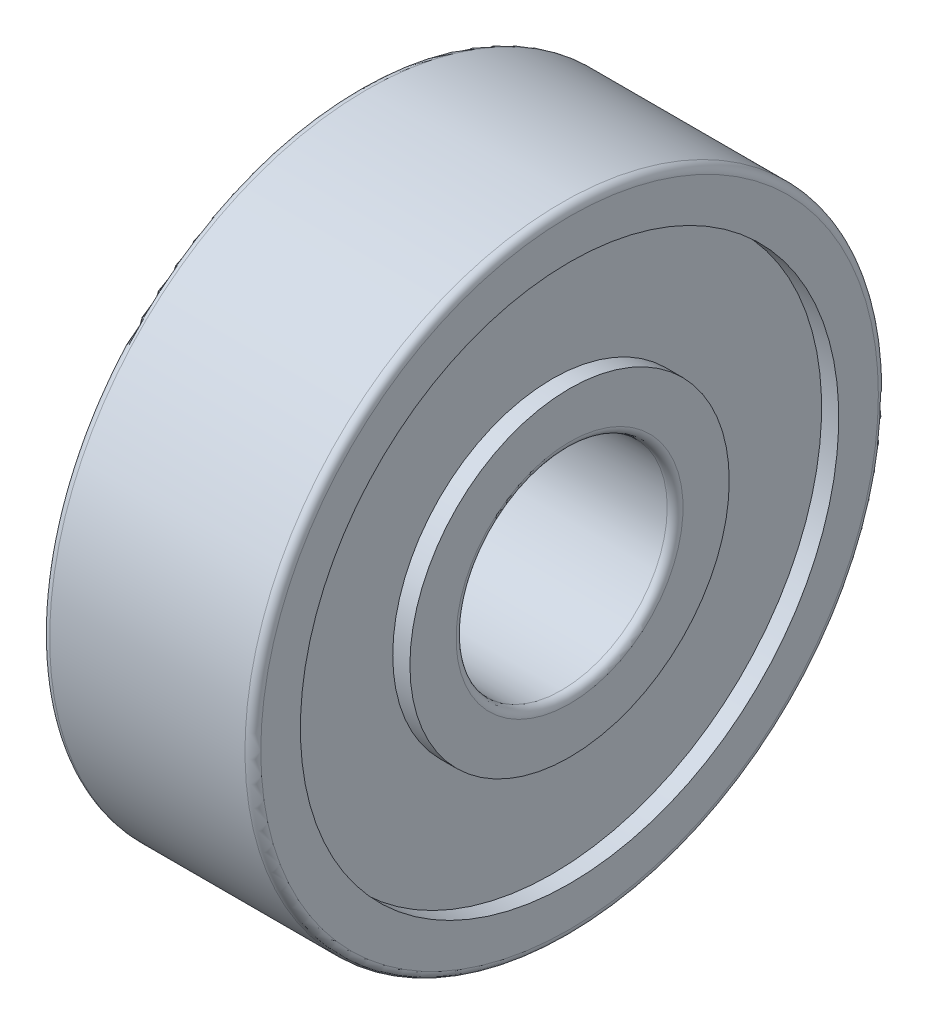
ISO-10303-21;
HEADER;
FILE_DESCRIPTION(('STEP AP214'),'2;1');
FILE_NAME('part.step','',(''),(''),'','','');
FILE_SCHEMA(('AUTOMOTIVE_DESIGN { 1 0 10303 214 1 1 1 1 }'));
ENDSEC;
DATA;
#1=APPLICATION_CONTEXT('core data for automotive mechanical design processes');
#2=APPLICATION_PROTOCOL_DEFINITION('international standard','automotive_design',2000,#1);
#3=PRODUCT_CONTEXT('',#1,'mechanical');
#4=PRODUCT('Part','Part','',(#3));
#5=PRODUCT_RELATED_PRODUCT_CATEGORY('part','',(#4));
#6=PRODUCT_DEFINITION_FORMATION('','',#4);
#7=PRODUCT_DEFINITION_CONTEXT('part definition',#1,'design');
#8=PRODUCT_DEFINITION('design','',#6,#7);
#9=PRODUCT_DEFINITION_SHAPE('','',#8);
#10=(LENGTH_UNIT() NAMED_UNIT(*) SI_UNIT(.MILLI.,.METRE.));
#11=(NAMED_UNIT(*) PLANE_ANGLE_UNIT() SI_UNIT($,.RADIAN.));
#12=(NAMED_UNIT(*) SI_UNIT($,.STERADIAN.) SOLID_ANGLE_UNIT());
#13=UNCERTAINTY_MEASURE_WITH_UNIT(LENGTH_MEASURE(1.E-05),#10,'distance_accuracy_value','');
#14=(GEOMETRIC_REPRESENTATION_CONTEXT(3) GLOBAL_UNCERTAINTY_ASSIGNED_CONTEXT((#13)) GLOBAL_UNIT_ASSIGNED_CONTEXT((#10,
#11,#12)) REPRESENTATION_CONTEXT('',''));
#15=CARTESIAN_POINT('',(0.,0.,0.));
#16=DIRECTION('',(0.,0.,1.));
#17=DIRECTION('',(1.,0.,0.));
#18=AXIS2_PLACEMENT_3D('',#15,#16,#17);
#19=CARTESIAN_POINT('',(0.,0.,0.));
#20=DIRECTION('',(-1.,0.,0.));
#21=DIRECTION('',(0.,-1.,0.));
#22=AXIS2_PLACEMENT_3D('',#19,#20,#21);
#23=CYLINDRICAL_SURFACE('',#22,4.);
#24=CARTESIAN_POINT('',(0.3,0.,0.));
#25=DIRECTION('',(1.,0.,0.));
#26=DIRECTION('',(0.,1.,0.));
#27=AXIS2_PLACEMENT_3D('',#24,#25,#26);
#28=CIRCLE('',#27,4.);
#29=CARTESIAN_POINT('',(0.3,4.,0.));
#30=VERTEX_POINT('',#29);
#31=EDGE_CURVE('E57',#30,#30,#28,.F.);
#32=ORIENTED_EDGE('',*,*,#31,.T.);
#33=EDGE_LOOP('',(#32));
#34=FACE_BOUND('',#33,.T.);
#35=CARTESIAN_POINT('',(7.7,0.,0.));
#36=DIRECTION('',(-1.,0.,0.));
#37=DIRECTION('',(0.,-1.,0.));
#38=AXIS2_PLACEMENT_3D('',#35,#36,#37);
#39=CIRCLE('',#38,4.);
#40=CARTESIAN_POINT('',(7.7,-4.,0.));
#41=VERTEX_POINT('',#40);
#42=EDGE_CURVE('E60',#41,#41,#39,.F.);
#43=ORIENTED_EDGE('',*,*,#42,.T.);
#44=EDGE_LOOP('',(#43));
#45=FACE_BOUND('',#44,.T.);
#46=ADVANCED_FACE('F31',(#34,#45),#23,.F.);
#47=CARTESIAN_POINT('',(0.,4.,0.));
#48=DIRECTION('',(1.,0.,0.));
#49=DIRECTION('',(0.,1.,0.));
#50=AXIS2_PLACEMENT_3D('',#47,#48,#49);
#51=PLANE('',#50);
#52=CARTESIAN_POINT('',(0.,0.,0.));
#53=DIRECTION('',(1.,0.,0.));
#54=DIRECTION('',(0.,1.,0.));
#55=AXIS2_PLACEMENT_3D('',#52,#53,#54);
#56=CIRCLE('',#55,4.3);
#57=CARTESIAN_POINT('',(0.,4.3,0.));
#58=VERTEX_POINT('',#57);
#59=EDGE_CURVE('E54',#58,#58,#56,.T.);
#60=ORIENTED_EDGE('',*,*,#59,.T.);
#61=EDGE_LOOP('',(#60));
#62=FACE_BOUND('',#61,.T.);
#63=CARTESIAN_POINT('',(0.,0.,0.));
#64=DIRECTION('',(-1.,0.,0.));
#65=DIRECTION('',(0.,-1.,0.));
#66=AXIS2_PLACEMENT_3D('',#63,#64,#65);
#67=CIRCLE('',#66,6.05);
#68=CARTESIAN_POINT('',(0.,-6.05,0.));
#69=VERTEX_POINT('',#68);
#70=EDGE_CURVE('E63',#69,#69,#67,.T.);
#71=ORIENTED_EDGE('',*,*,#70,.T.);
#72=EDGE_LOOP('',(#71));
#73=FACE_BOUND('',#72,.T.);
#74=ADVANCED_FACE('F106',(#62,#73),#51,.F.);
#75=CARTESIAN_POINT('',(0.,0.,0.));
#76=DIRECTION('',(-1.,0.,0.));
#77=DIRECTION('',(0.,-1.,0.));
#78=AXIS2_PLACEMENT_3D('',#75,#76,#77);
#79=CYLINDRICAL_SURFACE('',#78,6.05);
#80=ORIENTED_EDGE('',*,*,#70,.F.);
#81=EDGE_LOOP('',(#80));
#82=FACE_BOUND('',#81,.T.);
#83=CARTESIAN_POINT('',(0.65,0.,0.));
#84=DIRECTION('',(-1.,0.,0.));
#85=DIRECTION('',(0.,-1.,0.));
#86=AXIS2_PLACEMENT_3D('',#83,#84,#85);
#87=CIRCLE('',#86,6.05);
#88=CARTESIAN_POINT('',(0.649999999999999,-6.05,0.));
#89=VERTEX_POINT('',#88);
#90=EDGE_CURVE('E66',#89,#89,#87,.T.);
#91=ORIENTED_EDGE('',*,*,#90,.T.);
#92=EDGE_LOOP('',(#91));
#93=FACE_BOUND('',#92,.T.);
#94=ADVANCED_FACE('F112',(#82,#93),#79,.T.);
#95=CARTESIAN_POINT('',(0.65,6.05,0.));
#96=DIRECTION('',(1.,0.,0.));
#97=DIRECTION('',(0.,1.,0.));
#98=AXIS2_PLACEMENT_3D('',#95,#96,#97);
#99=PLANE('',#98);
#100=ORIENTED_EDGE('',*,*,#90,.F.);
#101=EDGE_LOOP('',(#100));
#102=FACE_BOUND('',#101,.T.);
#103=CARTESIAN_POINT('',(0.649999999999999,0.,0.));
#104=DIRECTION('',(-1.,0.,0.));
#105=DIRECTION('',(0.,-1.,0.));
#106=AXIS2_PLACEMENT_3D('',#103,#104,#105);
#107=CIRCLE('',#106,10.2);
#108=CARTESIAN_POINT('',(0.649999999999999,-10.2,0.));
#109=VERTEX_POINT('',#108);
#110=EDGE_CURVE('E69',#109,#109,#107,.T.);
#111=ORIENTED_EDGE('',*,*,#110,.T.);
#112=EDGE_LOOP('',(#111));
#113=FACE_BOUND('',#112,.T.);
#114=ADVANCED_FACE('F139',(#102,#113),#99,.F.);
#115=CARTESIAN_POINT('',(0.,0.,0.));
#116=DIRECTION('',(-1.,0.,0.));
#117=DIRECTION('',(0.,-1.,0.));
#118=AXIS2_PLACEMENT_3D('',#115,#116,#117);
#119=CYLINDRICAL_SURFACE('',#118,10.2);
#120=ORIENTED_EDGE('',*,*,#110,.F.);
#121=EDGE_LOOP('',(#120));
#122=FACE_BOUND('',#121,.T.);
#123=CARTESIAN_POINT('',(0.,0.,0.));
#124=DIRECTION('',(-1.,0.,0.));
#125=DIRECTION('',(0.,-1.,0.));
#126=AXIS2_PLACEMENT_3D('',#123,#124,#125);
#127=CIRCLE('',#126,10.2);
#128=CARTESIAN_POINT('',(0.,-10.2,0.));
#129=VERTEX_POINT('',#128);
#130=EDGE_CURVE('E72',#129,#129,#127,.T.);
#131=ORIENTED_EDGE('',*,*,#130,.T.);
#132=EDGE_LOOP('',(#131));
#133=FACE_BOUND('',#132,.T.);
#134=ADVANCED_FACE('F134',(#122,#133),#119,.F.);
#135=CARTESIAN_POINT('',(0.,10.2,0.));
#136=DIRECTION('',(1.,0.,0.));
#137=DIRECTION('',(0.,1.,0.));
#138=AXIS2_PLACEMENT_3D('',#135,#136,#137);
#139=PLANE('',#138);
#140=CARTESIAN_POINT('',(0.,0.,0.));
#141=DIRECTION('',(1.,0.,0.));
#142=DIRECTION('',(0.,1.,0.));
#143=AXIS2_PLACEMENT_3D('',#140,#141,#142);
#144=CIRCLE('',#143,11.7);
#145=CARTESIAN_POINT('',(0.,11.7,0.));
#146=VERTEX_POINT('',#145);
#147=EDGE_CURVE('E46',#146,#146,#144,.F.);
#148=ORIENTED_EDGE('',*,*,#147,.T.);
#149=EDGE_LOOP('',(#148));
#150=FACE_BOUND('',#149,.T.);
#151=ORIENTED_EDGE('',*,*,#130,.F.);
#152=EDGE_LOOP('',(#151));
#153=FACE_BOUND('',#152,.T.);
#154=ADVANCED_FACE('F130',(#150,#153),#139,.F.);
#155=CARTESIAN_POINT('',(0.,0.,0.));
#156=DIRECTION('',(-1.,0.,0.));
#157=DIRECTION('',(0.,-1.,0.));
#158=AXIS2_PLACEMENT_3D('',#155,#156,#157);
#159=CYLINDRICAL_SURFACE('',#158,12.);
#160=CARTESIAN_POINT('',(0.3,0.,0.));
#161=DIRECTION('',(1.,0.,0.));
#162=DIRECTION('',(0.,1.,0.));
#163=AXIS2_PLACEMENT_3D('',#160,#161,#162);
#164=CIRCLE('',#163,12.);
#165=CARTESIAN_POINT('',(0.3,12.,0.));
#166=VERTEX_POINT('',#165);
#167=EDGE_CURVE('E38',#166,#166,#164,.T.);
#168=ORIENTED_EDGE('',*,*,#167,.T.);
#169=EDGE_LOOP('',(#168));
#170=FACE_BOUND('',#169,.T.);
#171=CARTESIAN_POINT('',(7.7,0.,0.));
#172=DIRECTION('',(-1.,0.,0.));
#173=DIRECTION('',(0.,-1.,0.));
#174=AXIS2_PLACEMENT_3D('',#171,#172,#173);
#175=CIRCLE('',#174,12.);
#176=CARTESIAN_POINT('',(7.7,-12.,0.));
#177=VERTEX_POINT('',#176);
#178=EDGE_CURVE('E42',#177,#177,#175,.T.);
#179=ORIENTED_EDGE('',*,*,#178,.T.);
#180=EDGE_LOOP('',(#179));
#181=FACE_BOUND('',#180,.T.);
#182=ADVANCED_FACE('F133',(#170,#181),#159,.T.);
#183=CARTESIAN_POINT('',(8.,12.,0.));
#184=DIRECTION('',(-1.,0.,0.));
#185=DIRECTION('',(0.,-1.,0.));
#186=AXIS2_PLACEMENT_3D('',#183,#184,#185);
#187=PLANE('',#186);
#188=CARTESIAN_POINT('',(8.,0.,0.));
#189=DIRECTION('',(-1.,0.,0.));
#190=DIRECTION('',(0.,-1.,0.));
#191=AXIS2_PLACEMENT_3D('',#188,#189,#190);
#192=CIRCLE('',#191,11.7);
#193=CARTESIAN_POINT('',(8.,-11.7,0.));
#194=VERTEX_POINT('',#193);
#195=EDGE_CURVE('E10',#194,#194,#192,.F.);
#196=ORIENTED_EDGE('',*,*,#195,.T.);
#197=EDGE_LOOP('',(#196));
#198=FACE_BOUND('',#197,.T.);
#199=CARTESIAN_POINT('',(8.,0.,0.));
#200=DIRECTION('',(-1.,0.,0.));
#201=DIRECTION('',(0.,-1.,0.));
#202=AXIS2_PLACEMENT_3D('',#199,#200,#201);
#203=CIRCLE('',#202,10.2);
#204=CARTESIAN_POINT('',(8.,-10.2,0.));
#205=VERTEX_POINT('',#204);
#206=EDGE_CURVE('E75',#205,#205,#203,.T.);
#207=ORIENTED_EDGE('',*,*,#206,.T.);
#208=EDGE_LOOP('',(#207));
#209=FACE_BOUND('',#208,.T.);
#210=ADVANCED_FACE('F179',(#198,#209),#187,.F.);
#211=CARTESIAN_POINT('',(0.,0.,0.));
#212=DIRECTION('',(-1.,0.,0.));
#213=DIRECTION('',(0.,-1.,0.));
#214=AXIS2_PLACEMENT_3D('',#211,#212,#213);
#215=CYLINDRICAL_SURFACE('',#214,10.2);
#216=ORIENTED_EDGE('',*,*,#206,.F.);
#217=EDGE_LOOP('',(#216));
#218=FACE_BOUND('',#217,.T.);
#219=CARTESIAN_POINT('',(7.35,0.,0.));
#220=DIRECTION('',(-1.,0.,0.));
#221=DIRECTION('',(0.,-1.,0.));
#222=AXIS2_PLACEMENT_3D('',#219,#220,#221);
#223=CIRCLE('',#222,10.2);
#224=CARTESIAN_POINT('',(7.35,-10.2,0.));
#225=VERTEX_POINT('',#224);
#226=EDGE_CURVE('E78',#225,#225,#223,.T.);
#227=ORIENTED_EDGE('',*,*,#226,.T.);
#228=EDGE_LOOP('',(#227));
#229=FACE_BOUND('',#228,.T.);
#230=ADVANCED_FACE('F174',(#218,#229),#215,.F.);
#231=CARTESIAN_POINT('',(7.35,10.2,0.));
#232=DIRECTION('',(-1.,0.,0.));
#233=DIRECTION('',(0.,-1.,0.));
#234=AXIS2_PLACEMENT_3D('',#231,#232,#233);
#235=PLANE('',#234);
#236=ORIENTED_EDGE('',*,*,#226,.F.);
#237=EDGE_LOOP('',(#236));
#238=FACE_BOUND('',#237,.T.);
#239=CARTESIAN_POINT('',(7.35,0.,0.));
#240=DIRECTION('',(-1.,0.,0.));
#241=DIRECTION('',(0.,-1.,0.));
#242=AXIS2_PLACEMENT_3D('',#239,#240,#241);
#243=CIRCLE('',#242,6.05);
#244=CARTESIAN_POINT('',(7.35,-6.05,0.));
#245=VERTEX_POINT('',#244);
#246=EDGE_CURVE('E81',#245,#245,#243,.T.);
#247=ORIENTED_EDGE('',*,*,#246,.T.);
#248=EDGE_LOOP('',(#247));
#249=FACE_BOUND('',#248,.T.);
#250=ADVANCED_FACE('F102',(#238,#249),#235,.F.);
#251=CARTESIAN_POINT('',(0.,0.,0.));
#252=DIRECTION('',(-1.,0.,0.));
#253=DIRECTION('',(0.,-1.,0.));
#254=AXIS2_PLACEMENT_3D('',#251,#252,#253);
#255=CYLINDRICAL_SURFACE('',#254,6.05);
#256=ORIENTED_EDGE('',*,*,#246,.F.);
#257=EDGE_LOOP('',(#256));
#258=FACE_BOUND('',#257,.T.);
#259=CARTESIAN_POINT('',(8.,0.,0.));
#260=DIRECTION('',(-1.,0.,0.));
#261=DIRECTION('',(0.,-1.,0.));
#262=AXIS2_PLACEMENT_3D('',#259,#260,#261);
#263=CIRCLE('',#262,6.05);
#264=CARTESIAN_POINT('',(8.,-6.05,0.));
#265=VERTEX_POINT('',#264);
#266=EDGE_CURVE('E84',#265,#265,#263,.T.);
#267=ORIENTED_EDGE('',*,*,#266,.T.);
#268=EDGE_LOOP('',(#267));
#269=FACE_BOUND('',#268,.T.);
#270=ADVANCED_FACE('F88',(#258,#269),#255,.T.);
#271=CARTESIAN_POINT('',(8.,6.05,0.));
#272=DIRECTION('',(-1.,0.,0.));
#273=DIRECTION('',(0.,-1.,0.));
#274=AXIS2_PLACEMENT_3D('',#271,#272,#273);
#275=PLANE('',#274);
#276=CARTESIAN_POINT('',(8.,0.,0.));
#277=DIRECTION('',(-1.,0.,0.));
#278=DIRECTION('',(0.,-1.,0.));
#279=AXIS2_PLACEMENT_3D('',#276,#277,#278);
#280=CIRCLE('',#279,4.3);
#281=CARTESIAN_POINT('',(8.,-4.3,0.));
#282=VERTEX_POINT('',#281);
#283=EDGE_CURVE('E51',#282,#282,#280,.T.);
#284=ORIENTED_EDGE('',*,*,#283,.T.);
#285=EDGE_LOOP('',(#284));
#286=FACE_BOUND('',#285,.T.);
#287=ORIENTED_EDGE('',*,*,#266,.F.);
#288=EDGE_LOOP('',(#287));
#289=FACE_BOUND('',#288,.T.);
#290=ADVANCED_FACE('F90',(#286,#289),#275,.F.);
#291=CARTESIAN_POINT('',(0.3,0.,0.));
#292=DIRECTION('',(1.,0.,0.));
#293=DIRECTION('',(0.,1.,0.));
#294=AXIS2_PLACEMENT_3D('',#291,#292,#293);
#295=TOROIDAL_SURFACE('',#294,4.3,0.3);
#296=ORIENTED_EDGE('',*,*,#59,.F.);
#297=EDGE_LOOP('',(#296));
#298=FACE_BOUND('',#297,.T.);
#299=ORIENTED_EDGE('',*,*,#31,.F.);
#300=EDGE_LOOP('',(#299));
#301=FACE_BOUND('',#300,.T.);
#302=ADVANCED_FACE('F92',(#298,#301),#295,.T.);
#303=CARTESIAN_POINT('',(7.7,0.,0.));
#304=DIRECTION('',(-1.,0.,0.));
#305=DIRECTION('',(0.,-1.,0.));
#306=AXIS2_PLACEMENT_3D('',#303,#304,#305);
#307=TOROIDAL_SURFACE('',#306,4.3,0.3);
#308=ORIENTED_EDGE('',*,*,#42,.F.);
#309=EDGE_LOOP('',(#308));
#310=FACE_BOUND('',#309,.T.);
#311=ORIENTED_EDGE('',*,*,#283,.F.);
#312=EDGE_LOOP('',(#311));
#313=FACE_BOUND('',#312,.T.);
#314=ADVANCED_FACE('F99',(#310,#313),#307,.T.);
#315=CARTESIAN_POINT('',(0.3,0.,0.));
#316=DIRECTION('',(1.,0.,0.));
#317=DIRECTION('',(0.,1.,0.));
#318=AXIS2_PLACEMENT_3D('',#315,#316,#317);
#319=TOROIDAL_SURFACE('',#318,11.7,0.3);
#320=ORIENTED_EDGE('',*,*,#167,.F.);
#321=EDGE_LOOP('',(#320));
#322=FACE_BOUND('',#321,.T.);
#323=ORIENTED_EDGE('',*,*,#147,.F.);
#324=EDGE_LOOP('',(#323));
#325=FACE_BOUND('',#324,.T.);
#326=ADVANCED_FACE('F119',(#322,#325),#319,.T.);
#327=CARTESIAN_POINT('',(7.7,0.,0.));
#328=DIRECTION('',(-1.,0.,0.));
#329=DIRECTION('',(0.,-1.,0.));
#330=AXIS2_PLACEMENT_3D('',#327,#328,#329);
#331=TOROIDAL_SURFACE('',#330,11.7,0.3);
#332=ORIENTED_EDGE('',*,*,#195,.F.);
#333=EDGE_LOOP('',(#332));
#334=FACE_BOUND('',#333,.T.);
#335=ORIENTED_EDGE('',*,*,#178,.F.);
#336=EDGE_LOOP('',(#335));
#337=FACE_BOUND('',#336,.T.);
#338=ADVANCED_FACE('F33',(#334,#337),#331,.T.);
#339=CLOSED_SHELL('',(#46,#74,#94,#114,#134,#154,#182,#210,#230,#250,#270,#290,#302,#314,#326,#338));
#340=MANIFOLD_SOLID_BREP('B2',#339);
#341=ADVANCED_BREP_SHAPE_REPRESENTATION('',(#18,#340),#14);
#342=SHAPE_DEFINITION_REPRESENTATION(#9,#341);
ENDSEC;
END-ISO-10303-21;
